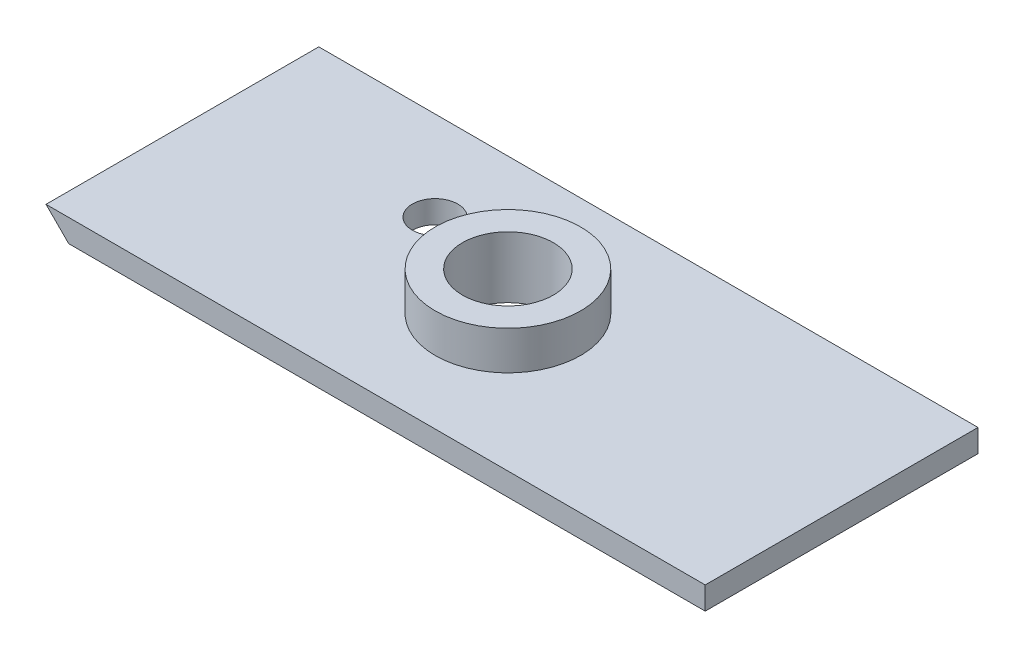
ISO-10303-21;
HEADER;
FILE_DESCRIPTION(('STEP AP214'),'2;1');
FILE_NAME('part.step','',(''),(''),'','','');
FILE_SCHEMA(('AUTOMOTIVE_DESIGN { 1 0 10303 214 1 1 1 1 }'));
ENDSEC;
DATA;
#1=APPLICATION_CONTEXT('core data for automotive mechanical design processes');
#2=APPLICATION_PROTOCOL_DEFINITION('international standard','automotive_design',2000,#1);
#3=PRODUCT_CONTEXT('',#1,'mechanical');
#4=PRODUCT('Part','Part','',(#3));
#5=PRODUCT_RELATED_PRODUCT_CATEGORY('part','',(#4));
#6=PRODUCT_DEFINITION_FORMATION('','',#4);
#7=PRODUCT_DEFINITION_CONTEXT('part definition',#1,'design');
#8=PRODUCT_DEFINITION('design','',#6,#7);
#9=PRODUCT_DEFINITION_SHAPE('','',#8);
#10=(LENGTH_UNIT() NAMED_UNIT(*) SI_UNIT(.MILLI.,.METRE.));
#11=(NAMED_UNIT(*) PLANE_ANGLE_UNIT() SI_UNIT($,.RADIAN.));
#12=(NAMED_UNIT(*) SI_UNIT($,.STERADIAN.) SOLID_ANGLE_UNIT());
#13=UNCERTAINTY_MEASURE_WITH_UNIT(LENGTH_MEASURE(1.E-05),#10,'distance_accuracy_value','');
#14=(GEOMETRIC_REPRESENTATION_CONTEXT(3) GLOBAL_UNCERTAINTY_ASSIGNED_CONTEXT((#13)) GLOBAL_UNIT_ASSIGNED_CONTEXT((#10,
#11,#12)) REPRESENTATION_CONTEXT('',''));
#15=CARTESIAN_POINT('',(0.,0.,0.));
#16=DIRECTION('',(0.,0.,1.));
#17=DIRECTION('',(1.,0.,0.));
#18=AXIS2_PLACEMENT_3D('',#15,#16,#17);
#19=CARTESIAN_POINT('',(0.,1.,0.));
#20=DIRECTION('',(0.,1.,0.));
#21=DIRECTION('',(0.,0.,1.));
#22=AXIS2_PLACEMENT_3D('',#19,#20,#21);
#23=PLANE('',#22);
#24=DIRECTION('',(0.,0.,-1.));
#25=VECTOR('',#24,1.);
#26=CARTESIAN_POINT('',(9.47239378261489,1.,7.94741871015199));
#27=LINE('',#26,#25);
#28=CARTESIAN_POINT('',(9.47239378261489,1.,7.94741871015199));
#29=VERTEX_POINT('',#28);
#30=CARTESIAN_POINT('',(9.47239378261489,1.,-4.05258128984801));
#31=VERTEX_POINT('',#30);
#32=EDGE_CURVE('E76',#29,#31,#27,.T.);
#33=ORIENTED_EDGE('',*,*,#32,.T.);
#34=DIRECTION('',(-1.,0.,0.));
#35=VECTOR('',#34,1.);
#36=CARTESIAN_POINT('',(-18.5276062173851,1.,-4.05258128984801));
#37=LINE('',#36,#35);
#38=CARTESIAN_POINT('',(-19.5276062173851,1.,-4.05258128984801));
#39=VERTEX_POINT('',#38);
#40=EDGE_CURVE('E11',#31,#39,#37,.T.);
#41=ORIENTED_EDGE('',*,*,#40,.T.);
#42=DIRECTION('',(0.,0.,-1.));
#43=VECTOR('',#42,1.);
#44=CARTESIAN_POINT('',(-19.5276062173851,1.,7.94741871015199));
#45=LINE('',#44,#43);
#46=CARTESIAN_POINT('',(-19.5276062173851,1.,7.94741871015199));
#47=VERTEX_POINT('',#46);
#48=EDGE_CURVE('E91',#47,#39,#45,.T.);
#49=ORIENTED_EDGE('',*,*,#48,.F.);
#50=DIRECTION('',(1.,0.,0.));
#51=VECTOR('',#50,1.);
#52=CARTESIAN_POINT('',(-18.5276062173851,1.,7.94741871015199));
#53=LINE('',#52,#51);
#54=EDGE_CURVE('E44',#47,#29,#53,.T.);
#55=ORIENTED_EDGE('',*,*,#54,.T.);
#56=EDGE_LOOP('',(#33,#41,#49,#55));
#57=FACE_BOUND('',#56,.T.);
#58=CARTESIAN_POINT('',(-10.4812096573851,1.,-0.122716729848009));
#59=DIRECTION('',(0.,1.,0.));
#60=DIRECTION('',(0.,0.,1.));
#61=AXIS2_PLACEMENT_3D('',#58,#59,#60);
#62=CIRCLE('',#61,1.);
#63=CARTESIAN_POINT('',(-10.4812096573851,1.,0.877283270151991));
#64=VERTEX_POINT('',#63);
#65=EDGE_CURVE('E115',#64,#64,#62,.T.);
#66=ORIENTED_EDGE('',*,*,#65,.F.);
#67=EDGE_LOOP('',(#66));
#68=FACE_BOUND('',#67,.T.);
#69=CARTESIAN_POINT('',(-5.2076062173851,1.,1.94741871015199));
#70=DIRECTION('',(0.,1.,0.));
#71=DIRECTION('',(0.,0.,1.));
#72=AXIS2_PLACEMENT_3D('',#69,#70,#71);
#73=CIRCLE('',#72,3.2);
#74=CARTESIAN_POINT('',(-5.2076062173851,1.,5.14741871015199));
#75=VERTEX_POINT('',#74);
#76=EDGE_CURVE('E106',#75,#75,#73,.T.);
#77=ORIENTED_EDGE('',*,*,#76,.F.);
#78=EDGE_LOOP('',(#77));
#79=FACE_BOUND('',#78,.T.);
#80=ADVANCED_FACE('F35',(#57,#68,#79),#23,.T.);
#81=CARTESIAN_POINT('',(0.,0.,0.));
#82=DIRECTION('',(0.,1.,0.));
#83=DIRECTION('',(0.,0.,1.));
#84=AXIS2_PLACEMENT_3D('',#81,#82,#83);
#85=PLANE('',#84);
#86=CARTESIAN_POINT('',(-10.4812096573851,0.,-0.122716729848009));
#87=DIRECTION('',(0.,-1.,0.));
#88=DIRECTION('',(0.,0.,-1.));
#89=AXIS2_PLACEMENT_3D('',#86,#87,#88);
#90=CIRCLE('',#89,1.);
#91=CARTESIAN_POINT('',(-10.4812096573851,0.,-1.12271672984801));
#92=VERTEX_POINT('',#91);
#93=EDGE_CURVE('E118',#92,#92,#90,.T.);
#94=ORIENTED_EDGE('',*,*,#93,.F.);
#95=EDGE_LOOP('',(#94));
#96=FACE_BOUND('',#95,.T.);
#97=DIRECTION('',(-1.,0.,0.));
#98=VECTOR('',#97,1.);
#99=CARTESIAN_POINT('',(-18.5276062173851,0.,-4.05258128984801));
#100=LINE('',#99,#98);
#101=CARTESIAN_POINT('',(9.47239378261489,0.,-4.05258128984801));
#102=VERTEX_POINT('',#101);
#103=CARTESIAN_POINT('',(-18.5276062173851,0.,-4.05258128984801));
#104=VERTEX_POINT('',#103);
#105=EDGE_CURVE('E39',#102,#104,#100,.T.);
#106=ORIENTED_EDGE('',*,*,#105,.F.);
#107=DIRECTION('',(0.,0.,-1.));
#108=VECTOR('',#107,1.);
#109=CARTESIAN_POINT('',(9.47239378261489,0.,7.94741871015199));
#110=LINE('',#109,#108);
#111=CARTESIAN_POINT('',(9.47239378261489,0.,7.94741871015199));
#112=VERTEX_POINT('',#111);
#113=EDGE_CURVE('E52',#112,#102,#110,.T.);
#114=ORIENTED_EDGE('',*,*,#113,.F.);
#115=DIRECTION('',(1.,0.,0.));
#116=VECTOR('',#115,1.);
#117=CARTESIAN_POINT('',(-18.5276062173851,0.,7.94741871015199));
#118=LINE('',#117,#116);
#119=CARTESIAN_POINT('',(-18.5276062173851,0.,7.94741871015199));
#120=VERTEX_POINT('',#119);
#121=EDGE_CURVE('E59',#120,#112,#118,.T.);
#122=ORIENTED_EDGE('',*,*,#121,.F.);
#123=DIRECTION('',(0.,0.,1.));
#124=VECTOR('',#123,1.);
#125=CARTESIAN_POINT('',(-18.5276062173851,0.,-4.05258128984801));
#126=LINE('',#125,#124);
#127=EDGE_CURVE('E98',#104,#120,#126,.T.);
#128=ORIENTED_EDGE('',*,*,#127,.F.);
#129=EDGE_LOOP('',(#106,#114,#122,#128));
#130=FACE_BOUND('',#129,.T.);
#131=CARTESIAN_POINT('',(-5.2076062173851,0.,1.94741871015199));
#132=DIRECTION('',(0.,1.,0.));
#133=DIRECTION('',(0.,0.,1.));
#134=AXIS2_PLACEMENT_3D('',#131,#132,#133);
#135=CIRCLE('',#134,2.);
#136=CARTESIAN_POINT('',(-5.2076062173851,0.,3.94741871015199));
#137=VERTEX_POINT('',#136);
#138=EDGE_CURVE('E95',#137,#137,#135,.T.);
#139=ORIENTED_EDGE('',*,*,#138,.T.);
#140=EDGE_LOOP('',(#139));
#141=FACE_BOUND('',#140,.T.);
#142=ADVANCED_FACE('F131',(#96,#130,#141),#85,.F.);
#143=CARTESIAN_POINT('',(-18.5276062173851,1.,7.94741871015199));
#144=DIRECTION('',(0.,0.,-1.));
#145=DIRECTION('',(-1.,0.,0.));
#146=AXIS2_PLACEMENT_3D('',#143,#144,#145);
#147=PLANE('',#146);
#148=ORIENTED_EDGE('',*,*,#121,.T.);
#149=DIRECTION('',(0.,-1.,0.));
#150=VECTOR('',#149,1.);
#151=CARTESIAN_POINT('',(9.47239378261489,1.,7.94741871015199));
#152=LINE('',#151,#150);
#153=EDGE_CURVE('E79',#29,#112,#152,.T.);
#154=ORIENTED_EDGE('',*,*,#153,.F.);
#155=ORIENTED_EDGE('',*,*,#54,.F.);
#156=DIRECTION('',(-0.707106781186534,0.707106781186561,0.));
#157=VECTOR('',#156,1.);
#158=CARTESIAN_POINT('',(-18.5276062173851,0.,7.94741871015199));
#159=LINE('',#158,#157);
#160=EDGE_CURVE('E122',#120,#47,#159,.T.);
#161=ORIENTED_EDGE('',*,*,#160,.F.);
#162=EDGE_LOOP('',(#148,#154,#155,#161));
#163=FACE_BOUND('',#162,.T.);
#164=ADVANCED_FACE('F37',(#163),#147,.F.);
#165=CARTESIAN_POINT('',(-18.5276062173851,1.,-4.05258128984801));
#166=DIRECTION('',(0.,0.,1.));
#167=DIRECTION('',(1.,0.,0.));
#168=AXIS2_PLACEMENT_3D('',#165,#166,#167);
#169=PLANE('',#168);
#170=ORIENTED_EDGE('',*,*,#40,.F.);
#171=DIRECTION('',(0.,-1.,0.));
#172=VECTOR('',#171,1.);
#173=CARTESIAN_POINT('',(9.47239378261489,1.,-4.05258128984801));
#174=LINE('',#173,#172);
#175=EDGE_CURVE('E80',#31,#102,#174,.T.);
#176=ORIENTED_EDGE('',*,*,#175,.T.);
#177=ORIENTED_EDGE('',*,*,#105,.T.);
#178=DIRECTION('',(-0.707106781186534,0.707106781186561,0.));
#179=VECTOR('',#178,1.);
#180=CARTESIAN_POINT('',(-18.5276062173851,0.,-4.05258128984801));
#181=LINE('',#180,#179);
#182=EDGE_CURVE('E123',#104,#39,#181,.T.);
#183=ORIENTED_EDGE('',*,*,#182,.T.);
#184=EDGE_LOOP('',(#170,#176,#177,#183));
#185=FACE_BOUND('',#184,.T.);
#186=ADVANCED_FACE('F130',(#185),#169,.F.);
#187=CARTESIAN_POINT('',(-5.2076062173851,1.,1.94741871015199));
#188=DIRECTION('',(0.,-1.,0.));
#189=DIRECTION('',(0.,0.,-1.));
#190=AXIS2_PLACEMENT_3D('',#187,#188,#189);
#191=CYLINDRICAL_SURFACE('',#190,2.);
#192=ORIENTED_EDGE('',*,*,#138,.F.);
#193=EDGE_LOOP('',(#192));
#194=FACE_BOUND('',#193,.T.);
#195=CARTESIAN_POINT('',(-5.2076062173851,2.7,1.94741871015199));
#196=DIRECTION('',(0.,1.,0.));
#197=DIRECTION('',(0.,0.,1.));
#198=AXIS2_PLACEMENT_3D('',#195,#196,#197);
#199=CIRCLE('',#198,2.);
#200=CARTESIAN_POINT('',(-5.2076062173851,2.7,3.94741871015199));
#201=VERTEX_POINT('',#200);
#202=EDGE_CURVE('E111',#201,#201,#199,.T.);
#203=ORIENTED_EDGE('',*,*,#202,.T.);
#204=EDGE_LOOP('',(#203));
#205=FACE_BOUND('',#204,.T.);
#206=ADVANCED_FACE('F152',(#194,#205),#191,.F.);
#207=CARTESIAN_POINT('',(-5.2076062173851,2.7,1.94741871015199));
#208=DIRECTION('',(0.,1.,0.));
#209=DIRECTION('',(0.,0.,1.));
#210=AXIS2_PLACEMENT_3D('',#207,#208,#209);
#211=PLANE('',#210);
#212=CARTESIAN_POINT('',(-5.2076062173851,2.7,1.94741871015199));
#213=DIRECTION('',(0.,1.,0.));
#214=DIRECTION('',(0.,0.,1.));
#215=AXIS2_PLACEMENT_3D('',#212,#213,#214);
#216=CIRCLE('',#215,3.2);
#217=CARTESIAN_POINT('',(-5.2076062173851,2.7,5.14741871015199));
#218=VERTEX_POINT('',#217);
#219=EDGE_CURVE('E102',#218,#218,#216,.T.);
#220=ORIENTED_EDGE('',*,*,#219,.T.);
#221=EDGE_LOOP('',(#220));
#222=FACE_BOUND('',#221,.T.);
#223=ORIENTED_EDGE('',*,*,#202,.F.);
#224=EDGE_LOOP('',(#223));
#225=FACE_BOUND('',#224,.T.);
#226=ADVANCED_FACE('F159',(#222,#225),#211,.T.);
#227=CARTESIAN_POINT('',(-5.2076062173851,2.7,1.94741871015199));
#228=DIRECTION('',(0.,-1.,0.));
#229=DIRECTION('',(0.,0.,-1.));
#230=AXIS2_PLACEMENT_3D('',#227,#228,#229);
#231=CYLINDRICAL_SURFACE('',#230,3.2);
#232=ORIENTED_EDGE('',*,*,#219,.F.);
#233=EDGE_LOOP('',(#232));
#234=FACE_BOUND('',#233,.T.);
#235=ORIENTED_EDGE('',*,*,#76,.T.);
#236=EDGE_LOOP('',(#235));
#237=FACE_BOUND('',#236,.T.);
#238=ADVANCED_FACE('F141',(#234,#237),#231,.T.);
#239=CARTESIAN_POINT('',(-10.4812096573851,5.,-0.122716729848009));
#240=DIRECTION('',(0.,-1.,0.));
#241=DIRECTION('',(0.,0.,-1.));
#242=AXIS2_PLACEMENT_3D('',#239,#240,#241);
#243=CYLINDRICAL_SURFACE('',#242,1.);
#244=ORIENTED_EDGE('',*,*,#65,.T.);
#245=EDGE_LOOP('',(#244));
#246=FACE_BOUND('',#245,.T.);
#247=ORIENTED_EDGE('',*,*,#93,.T.);
#248=EDGE_LOOP('',(#247));
#249=FACE_BOUND('',#248,.T.);
#250=ADVANCED_FACE('F134',(#246,#249),#243,.F.);
#251=CARTESIAN_POINT('',(-18.5276062173851,0.,7.94741871015199));
#252=DIRECTION('',(-0.707106781186561,-0.707106781186534,0.));
#253=DIRECTION('',(0.707106781186534,-0.707106781186561,0.));
#254=AXIS2_PLACEMENT_3D('',#251,#252,#253);
#255=PLANE('',#254);
#256=ORIENTED_EDGE('',*,*,#182,.F.);
#257=ORIENTED_EDGE('',*,*,#127,.T.);
#258=ORIENTED_EDGE('',*,*,#160,.T.);
#259=ORIENTED_EDGE('',*,*,#48,.T.);
#260=EDGE_LOOP('',(#256,#257,#258,#259));
#261=FACE_BOUND('',#260,.T.);
#262=ADVANCED_FACE('F132',(#261),#255,.T.);
#263=CARTESIAN_POINT('',(9.47239378261489,1.,7.94741871015199));
#264=DIRECTION('',(-1.,0.,0.));
#265=DIRECTION('',(0.,0.,1.));
#266=AXIS2_PLACEMENT_3D('',#263,#264,#265);
#267=PLANE('',#266);
#268=ORIENTED_EDGE('',*,*,#113,.T.);
#269=ORIENTED_EDGE('',*,*,#175,.F.);
#270=ORIENTED_EDGE('',*,*,#32,.F.);
#271=ORIENTED_EDGE('',*,*,#153,.T.);
#272=EDGE_LOOP('',(#268,#269,#270,#271));
#273=FACE_BOUND('',#272,.T.);
#274=ADVANCED_FACE('F78',(#273),#267,.F.);
#275=CLOSED_SHELL('',(#80,#142,#164,#186,#206,#226,#238,#250,#262,#274));
#276=MANIFOLD_SOLID_BREP('B2',#275);
#277=ADVANCED_BREP_SHAPE_REPRESENTATION('',(#18,#276),#14);
#278=SHAPE_DEFINITION_REPRESENTATION(#9,#277);
ENDSEC;
END-ISO-10303-21;
